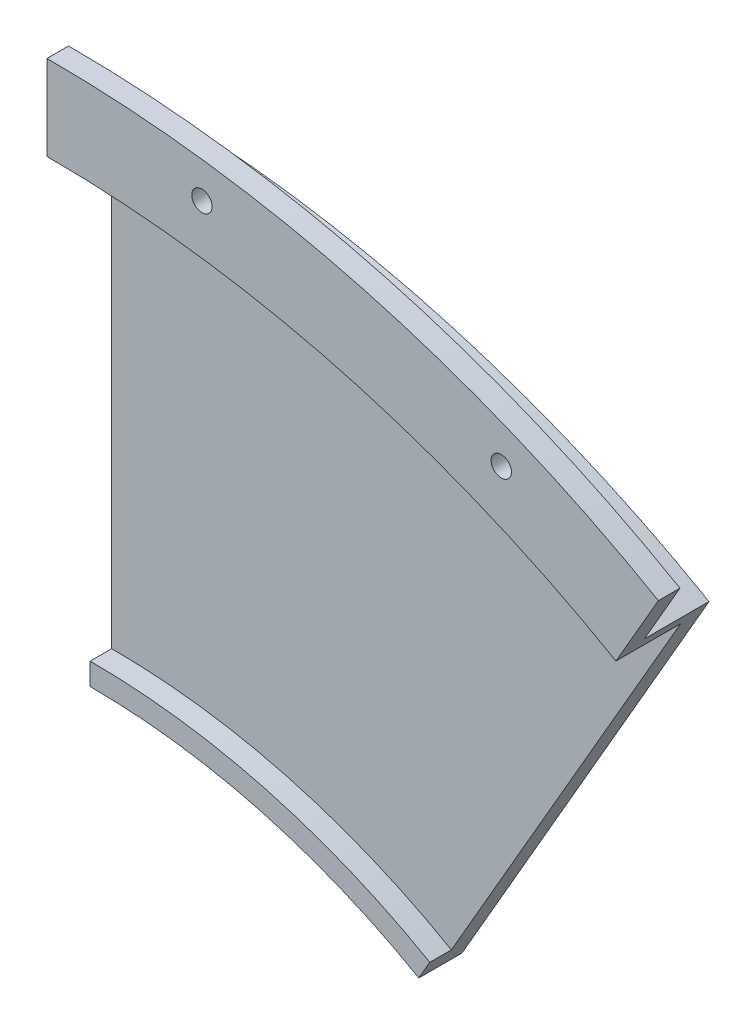
ISO-10303-21;
HEADER;
FILE_DESCRIPTION(('STEP AP214'),'2;1');
FILE_NAME('part.step','',(''),(''),'','','');
FILE_SCHEMA(('AUTOMOTIVE_DESIGN { 1 0 10303 214 1 1 1 1 }'));
ENDSEC;
DATA;
#1=APPLICATION_CONTEXT('core data for automotive mechanical design processes');
#2=APPLICATION_PROTOCOL_DEFINITION('international standard','automotive_design',2000,#1);
#3=PRODUCT_CONTEXT('',#1,'mechanical');
#4=PRODUCT('Part','Part','',(#3));
#5=PRODUCT_RELATED_PRODUCT_CATEGORY('part','',(#4));
#6=PRODUCT_DEFINITION_FORMATION('','',#4);
#7=PRODUCT_DEFINITION_CONTEXT('part definition',#1,'design');
#8=PRODUCT_DEFINITION('design','',#6,#7);
#9=PRODUCT_DEFINITION_SHAPE('','',#8);
#10=(LENGTH_UNIT() NAMED_UNIT(*) SI_UNIT(.MILLI.,.METRE.));
#11=(NAMED_UNIT(*) PLANE_ANGLE_UNIT() SI_UNIT($,.RADIAN.));
#12=(NAMED_UNIT(*) SI_UNIT($,.STERADIAN.) SOLID_ANGLE_UNIT());
#13=UNCERTAINTY_MEASURE_WITH_UNIT(LENGTH_MEASURE(1.E-05),#10,'distance_accuracy_value','');
#14=(GEOMETRIC_REPRESENTATION_CONTEXT(3) GLOBAL_UNCERTAINTY_ASSIGNED_CONTEXT((#13)) GLOBAL_UNIT_ASSIGNED_CONTEXT((#10,
#11,#12)) REPRESENTATION_CONTEXT('',''));
#15=CARTESIAN_POINT('',(0.,0.,0.));
#16=DIRECTION('',(0.,0.,1.));
#17=DIRECTION('',(1.,0.,0.));
#18=AXIS2_PLACEMENT_3D('',#15,#16,#17);
#19=CARTESIAN_POINT('',(0.,0.,12.7));
#20=DIRECTION('',(0.,0.,-1.));
#21=DIRECTION('',(-1.,0.,0.));
#22=AXIS2_PLACEMENT_3D('',#19,#20,#21);
#23=CYLINDRICAL_SURFACE('',#22,180.);
#24=CARTESIAN_POINT('',(0.,0.,9.525));
#25=DIRECTION('',(0.,0.,-1.));
#26=DIRECTION('',(-1.,0.,0.));
#27=AXIS2_PLACEMENT_3D('',#24,#25,#26);
#28=CIRCLE('',#27,180.);
#29=CARTESIAN_POINT('',(0.,180.,9.525));
#30=VERTEX_POINT('',#29);
#31=CARTESIAN_POINT('',(90.0000000000002,155.884572681199,9.525));
#32=VERTEX_POINT('',#31);
#33=EDGE_CURVE('E129',#30,#32,#28,.T.);
#34=ORIENTED_EDGE('',*,*,#33,.F.);
#35=DIRECTION('',(0.,0.,-1.));
#36=VECTOR('',#35,1.);
#37=CARTESIAN_POINT('',(0.,180.,12.7));
#38=LINE('',#37,#36);
#39=CARTESIAN_POINT('',(0.,180.,12.7));
#40=VERTEX_POINT('',#39);
#41=EDGE_CURVE('E128',#40,#30,#38,.T.);
#42=ORIENTED_EDGE('',*,*,#41,.F.);
#43=CARTESIAN_POINT('',(0.,0.,12.7));
#44=DIRECTION('',(0.,0.,1.));
#45=DIRECTION('',(1.,0.,0.));
#46=AXIS2_PLACEMENT_3D('',#43,#44,#45);
#47=CIRCLE('',#46,180.);
#48=CARTESIAN_POINT('',(90.0000000000002,155.884572681199,12.7));
#49=VERTEX_POINT('',#48);
#50=EDGE_CURVE('E173',#49,#40,#47,.T.);
#51=ORIENTED_EDGE('',*,*,#50,.F.);
#52=DIRECTION('',(0.,0.,-1.));
#53=VECTOR('',#52,1.);
#54=CARTESIAN_POINT('',(90.0000000000002,155.884572681199,12.7));
#55=LINE('',#54,#53);
#56=EDGE_CURVE('E41',#49,#32,#55,.T.);
#57=ORIENTED_EDGE('',*,*,#56,.T.);
#58=EDGE_LOOP('',(#34,#42,#51,#57));
#59=FACE_BOUND('',#58,.T.);
#60=ADVANCED_FACE('F33',(#59),#23,.T.);
#61=CARTESIAN_POINT('',(0.,0.,12.7));
#62=DIRECTION('',(0.,0.,-1.));
#63=DIRECTION('',(-1.,0.,0.));
#64=AXIS2_PLACEMENT_3D('',#61,#62,#63);
#65=CYLINDRICAL_SURFACE('',#64,96.7566582339079);
#66=CARTESIAN_POINT('',(0.,0.,6.35));
#67=DIRECTION('',(0.,0.,-1.));
#68=DIRECTION('',(1.,0.,0.));
#69=AXIS2_PLACEMENT_3D('',#66,#67,#68);
#70=CIRCLE('',#69,96.7566582339079);
#71=CARTESIAN_POINT('',(0.,96.7566582339079,6.35));
#72=VERTEX_POINT('',#71);
#73=CARTESIAN_POINT('',(48.378329116954,83.7937240158529,6.35));
#74=VERTEX_POINT('',#73);
#75=EDGE_CURVE('E137',#72,#74,#70,.T.);
#76=ORIENTED_EDGE('',*,*,#75,.F.);
#77=DIRECTION('',(0.,0.,-1.));
#78=VECTOR('',#77,1.);
#79=CARTESIAN_POINT('',(0.,96.7566582339079,12.7));
#80=LINE('',#79,#78);
#81=CARTESIAN_POINT('',(0.,96.7566582339079,0.));
#82=VERTEX_POINT('',#81);
#83=EDGE_CURVE('E179',#72,#82,#80,.T.);
#84=ORIENTED_EDGE('',*,*,#83,.T.);
#85=CARTESIAN_POINT('',(0.,0.,0.));
#86=DIRECTION('',(0.,0.,-1.));
#87=DIRECTION('',(-1.,0.,0.));
#88=AXIS2_PLACEMENT_3D('',#85,#86,#87);
#89=CIRCLE('',#88,96.7566582339079);
#90=CARTESIAN_POINT('',(48.378329116954,83.7937240158529,0.));
#91=VERTEX_POINT('',#90);
#92=EDGE_CURVE('E163',#82,#91,#89,.T.);
#93=ORIENTED_EDGE('',*,*,#92,.T.);
#94=DIRECTION('',(0.,0.,-1.));
#95=VECTOR('',#94,1.);
#96=CARTESIAN_POINT('',(48.378329116954,83.7937240158529,12.7));
#97=LINE('',#96,#95);
#98=EDGE_CURVE('E11',#74,#91,#97,.T.);
#99=ORIENTED_EDGE('',*,*,#98,.F.);
#100=EDGE_LOOP('',(#76,#84,#93,#99));
#101=FACE_BOUND('',#100,.T.);
#102=ADVANCED_FACE('F35',(#101),#65,.F.);
#103=CARTESIAN_POINT('',(48.378329116954,83.7937240158529,12.7));
#104=DIRECTION('',(-0.866025403784438,0.500000000000001,0.));
#105=DIRECTION('',(-0.500000000000001,-0.866025403784438,0.));
#106=AXIS2_PLACEMENT_3D('',#103,#104,#105);
#107=PLANE('',#106);
#108=DIRECTION('',(0.500000000000001,0.866025403784438,0.));
#109=VECTOR('',#108,1.);
#110=CARTESIAN_POINT('',(48.378329116954,83.7937240158529,0.));
#111=LINE('',#110,#109);
#112=CARTESIAN_POINT('',(84.7500000000002,146.791305941462,0.));
#113=VERTEX_POINT('',#112);
#114=EDGE_CURVE('E182',#91,#113,#111,.T.);
#115=ORIENTED_EDGE('',*,*,#114,.T.);
#116=DIRECTION('',(0.,0.,-1.));
#117=VECTOR('',#116,1.);
#118=CARTESIAN_POINT('',(84.7500000000002,146.791305941462,9.525));
#119=LINE('',#118,#117);
#120=CARTESIAN_POINT('',(84.7500000000002,146.791305941462,9.525));
#121=VERTEX_POINT('',#120);
#122=EDGE_CURVE('E48',#121,#113,#119,.T.);
#123=ORIENTED_EDGE('',*,*,#122,.F.);
#124=DIRECTION('',(-0.500000000000002,-0.866025403784437,0.));
#125=VECTOR('',#124,1.);
#126=CARTESIAN_POINT('',(84.7500000000002,146.791305941462,9.525));
#127=LINE('',#126,#125);
#128=EDGE_CURVE('E116',#32,#121,#127,.T.);
#129=ORIENTED_EDGE('',*,*,#128,.F.);
#130=ORIENTED_EDGE('',*,*,#56,.F.);
#131=DIRECTION('',(0.500000000000001,0.866025403784438,0.));
#132=VECTOR('',#131,1.);
#133=CARTESIAN_POINT('',(48.378329116954,83.7937240158529,12.7));
#134=LINE('',#133,#132);
#135=CARTESIAN_POINT('',(83.7500000000002,145.059255133893,12.7));
#136=VERTEX_POINT('',#135);
#137=EDGE_CURVE('E171',#136,#49,#134,.T.);
#138=ORIENTED_EDGE('',*,*,#137,.F.);
#139=DIRECTION('',(0.,0.,1.));
#140=VECTOR('',#139,1.);
#141=CARTESIAN_POINT('',(83.7500000000002,145.059255133893,3.175));
#142=LINE('',#141,#140);
#143=CARTESIAN_POINT('',(83.7500000000002,145.059255133893,3.175));
#144=VERTEX_POINT('',#143);
#145=EDGE_CURVE('E167',#144,#136,#142,.T.);
#146=ORIENTED_EDGE('',*,*,#145,.F.);
#147=DIRECTION('',(0.500000000000001,0.866025403784438,0.));
#148=VECTOR('',#147,1.);
#149=CARTESIAN_POINT('',(50.0000000000001,86.6025403784438,3.175));
#150=LINE('',#149,#148);
#151=CARTESIAN_POINT('',(50.0000000000001,86.6025403784438,3.175));
#152=VERTEX_POINT('',#151);
#153=EDGE_CURVE('E149',#152,#144,#150,.T.);
#154=ORIENTED_EDGE('',*,*,#153,.F.);
#155=DIRECTION('',(0.,0.,1.));
#156=VECTOR('',#155,1.);
#157=CARTESIAN_POINT('',(50.0000000000001,86.6025403784438,3.175));
#158=LINE('',#157,#156);
#159=CARTESIAN_POINT('',(50.0000000000001,86.6025403784438,6.35));
#160=VERTEX_POINT('',#159);
#161=EDGE_CURVE('E158',#152,#160,#158,.T.);
#162=ORIENTED_EDGE('',*,*,#161,.T.);
#163=DIRECTION('',(0.500000000000002,0.866025403784437,0.));
#164=VECTOR('',#163,1.);
#165=CARTESIAN_POINT('',(48.378329116954,83.7937240158529,6.35));
#166=LINE('',#165,#164);
#167=EDGE_CURVE('E56',#74,#160,#166,.T.);
#168=ORIENTED_EDGE('',*,*,#167,.F.);
#169=ORIENTED_EDGE('',*,*,#98,.T.);
#170=EDGE_LOOP('',(#115,#123,#129,#130,#138,#146,#154,#162,#168,#169));
#171=FACE_BOUND('',#170,.T.);
#172=ADVANCED_FACE('F194',(#171),#107,.F.);
#173=CARTESIAN_POINT('',(0.,96.7566582339079,12.7));
#174=DIRECTION('',(1.,0.,0.));
#175=DIRECTION('',(0.,0.,-1.));
#176=AXIS2_PLACEMENT_3D('',#173,#174,#175);
#177=PLANE('',#176);
#178=DIRECTION('',(0.,1.,0.));
#179=VECTOR('',#178,1.);
#180=CARTESIAN_POINT('',(0.,169.5,9.525));
#181=LINE('',#180,#179);
#182=CARTESIAN_POINT('',(0.,169.5,9.525));
#183=VERTEX_POINT('',#182);
#184=EDGE_CURVE('E120',#183,#30,#181,.T.);
#185=ORIENTED_EDGE('',*,*,#184,.F.);
#186=DIRECTION('',(0.,0.,-1.));
#187=VECTOR('',#186,1.);
#188=CARTESIAN_POINT('',(0.,169.5,9.525));
#189=LINE('',#188,#187);
#190=CARTESIAN_POINT('',(0.,169.5,0.));
#191=VERTEX_POINT('',#190);
#192=EDGE_CURVE('E107',#183,#191,#189,.T.);
#193=ORIENTED_EDGE('',*,*,#192,.T.);
#194=DIRECTION('',(0.,-1.,0.));
#195=VECTOR('',#194,1.);
#196=CARTESIAN_POINT('',(0.,96.7566582339079,0.));
#197=LINE('',#196,#195);
#198=EDGE_CURVE('E174',#191,#82,#197,.T.);
#199=ORIENTED_EDGE('',*,*,#198,.T.);
#200=ORIENTED_EDGE('',*,*,#83,.F.);
#201=DIRECTION('',(0.,-1.,0.));
#202=VECTOR('',#201,1.);
#203=CARTESIAN_POINT('',(0.,96.7566582339079,6.35));
#204=LINE('',#203,#202);
#205=CARTESIAN_POINT('',(0.,100.,6.35));
#206=VERTEX_POINT('',#205);
#207=EDGE_CURVE('E143',#206,#72,#204,.T.);
#208=ORIENTED_EDGE('',*,*,#207,.F.);
#209=DIRECTION('',(0.,0.,1.));
#210=VECTOR('',#209,1.);
#211=CARTESIAN_POINT('',(0.,100.,3.175));
#212=LINE('',#211,#210);
#213=CARTESIAN_POINT('',(0.,100.,3.175));
#214=VERTEX_POINT('',#213);
#215=EDGE_CURVE('E160',#214,#206,#212,.T.);
#216=ORIENTED_EDGE('',*,*,#215,.F.);
#217=DIRECTION('',(0.,-1.,0.));
#218=VECTOR('',#217,1.);
#219=CARTESIAN_POINT('',(0.,100.,3.175));
#220=LINE('',#219,#218);
#221=CARTESIAN_POINT('',(0.,167.5,3.175));
#222=VERTEX_POINT('',#221);
#223=EDGE_CURVE('E155',#222,#214,#220,.T.);
#224=ORIENTED_EDGE('',*,*,#223,.F.);
#225=DIRECTION('',(0.,0.,1.));
#226=VECTOR('',#225,1.);
#227=CARTESIAN_POINT('',(0.,167.5,3.175));
#228=LINE('',#227,#226);
#229=CARTESIAN_POINT('',(0.,167.5,12.7));
#230=VERTEX_POINT('',#229);
#231=EDGE_CURVE('E164',#222,#230,#228,.T.);
#232=ORIENTED_EDGE('',*,*,#231,.T.);
#233=DIRECTION('',(0.,-1.,0.));
#234=VECTOR('',#233,1.);
#235=CARTESIAN_POINT('',(0.,96.7566582339079,12.7));
#236=LINE('',#235,#234);
#237=EDGE_CURVE('E176',#40,#230,#236,.T.);
#238=ORIENTED_EDGE('',*,*,#237,.F.);
#239=ORIENTED_EDGE('',*,*,#41,.T.);
#240=EDGE_LOOP('',(#185,#193,#199,#200,#208,#216,#224,#232,#238,#239));
#241=FACE_BOUND('',#240,.T.);
#242=ADVANCED_FACE('F125',(#241),#177,.F.);
#243=CARTESIAN_POINT('',(0.,0.,3.175));
#244=DIRECTION('',(0.,0.,1.));
#245=DIRECTION('',(1.,0.,0.));
#246=AXIS2_PLACEMENT_3D('',#243,#244,#245);
#247=CYLINDRICAL_SURFACE('',#246,100.);
#248=CARTESIAN_POINT('',(0.,0.,6.35));
#249=DIRECTION('',(0.,0.,1.));
#250=DIRECTION('',(1.,0.,0.));
#251=AXIS2_PLACEMENT_3D('',#248,#249,#250);
#252=CIRCLE('',#251,100.);
#253=EDGE_CURVE('E141',#160,#206,#252,.T.);
#254=ORIENTED_EDGE('',*,*,#253,.F.);
#255=ORIENTED_EDGE('',*,*,#161,.F.);
#256=CARTESIAN_POINT('',(0.,0.,3.175));
#257=DIRECTION('',(0.,0.,-1.));
#258=DIRECTION('',(1.,0.,0.));
#259=AXIS2_PLACEMENT_3D('',#256,#257,#258);
#260=CIRCLE('',#259,100.);
#261=EDGE_CURVE('E146',#214,#152,#260,.T.);
#262=ORIENTED_EDGE('',*,*,#261,.F.);
#263=ORIENTED_EDGE('',*,*,#215,.T.);
#264=EDGE_LOOP('',(#254,#255,#262,#263));
#265=FACE_BOUND('',#264,.T.);
#266=ADVANCED_FACE('F208',(#265),#247,.T.);
#267=CARTESIAN_POINT('',(0.,0.,12.7));
#268=DIRECTION('',(0.,0.,-1.));
#269=DIRECTION('',(-1.,0.,0.));
#270=AXIS2_PLACEMENT_3D('',#267,#268,#269);
#271=PLANE('',#270);
#272=CARTESIAN_POINT('',(66.8739298057996,161.447948306347,12.7));
#273=DIRECTION('',(0.,0.,-1.));
#274=DIRECTION('',(1.,0.,0.));
#275=AXIS2_PLACEMENT_3D('',#272,#273,#274);
#276=CIRCLE('',#275,1.49999999999999);
#277=CARTESIAN_POINT('',(68.3739298057996,161.447948306347,12.7));
#278=VERTEX_POINT('',#277);
#279=EDGE_CURVE('E250',#278,#278,#276,.T.);
#280=ORIENTED_EDGE('',*,*,#279,.T.);
#281=EDGE_LOOP('',(#280));
#282=FACE_BOUND('',#281,.T.);
#283=CARTESIAN_POINT('',(22.8094520904541,173.254989525073,12.7));
#284=DIRECTION('',(0.,0.,-1.));
#285=DIRECTION('',(-1.,0.,0.));
#286=AXIS2_PLACEMENT_3D('',#283,#284,#285);
#287=CIRCLE('',#286,1.5);
#288=CARTESIAN_POINT('',(21.3094520904541,173.254989525073,12.7));
#289=VERTEX_POINT('',#288);
#290=EDGE_CURVE('E136',#289,#289,#287,.T.);
#291=ORIENTED_EDGE('',*,*,#290,.T.);
#292=EDGE_LOOP('',(#291));
#293=FACE_BOUND('',#292,.T.);
#294=ORIENTED_EDGE('',*,*,#237,.T.);
#295=CARTESIAN_POINT('',(0.,0.,12.7));
#296=DIRECTION('',(0.,0.,1.));
#297=DIRECTION('',(1.,0.,0.));
#298=AXIS2_PLACEMENT_3D('',#295,#296,#297);
#299=CIRCLE('',#298,167.5);
#300=EDGE_CURVE('E145',#136,#230,#299,.T.);
#301=ORIENTED_EDGE('',*,*,#300,.F.);
#302=ORIENTED_EDGE('',*,*,#137,.T.);
#303=ORIENTED_EDGE('',*,*,#50,.T.);
#304=EDGE_LOOP('',(#294,#301,#302,#303));
#305=FACE_BOUND('',#304,.T.);
#306=ADVANCED_FACE('F215',(#282,#293,#305),#271,.F.);
#307=CARTESIAN_POINT('',(0.,0.,0.));
#308=DIRECTION('',(0.,0.,-1.));
#309=DIRECTION('',(-1.,0.,0.));
#310=AXIS2_PLACEMENT_3D('',#307,#308,#309);
#311=PLANE('',#310);
#312=CARTESIAN_POINT('',(0.,0.,0.));
#313=DIRECTION('',(0.,0.,1.));
#314=DIRECTION('',(-1.,0.,0.));
#315=AXIS2_PLACEMENT_3D('',#312,#313,#314);
#316=CIRCLE('',#315,169.5);
#317=EDGE_CURVE('E112',#113,#191,#316,.T.);
#318=ORIENTED_EDGE('',*,*,#317,.F.);
#319=ORIENTED_EDGE('',*,*,#114,.F.);
#320=ORIENTED_EDGE('',*,*,#92,.F.);
#321=ORIENTED_EDGE('',*,*,#198,.F.);
#322=EDGE_LOOP('',(#318,#319,#320,#321));
#323=FACE_BOUND('',#322,.T.);
#324=ADVANCED_FACE('F200',(#323),#311,.T.);
#325=CARTESIAN_POINT('',(0.,0.,3.175));
#326=DIRECTION('',(0.,0.,1.));
#327=DIRECTION('',(1.,0.,0.));
#328=AXIS2_PLACEMENT_3D('',#325,#326,#327);
#329=CYLINDRICAL_SURFACE('',#328,167.5);
#330=ORIENTED_EDGE('',*,*,#300,.T.);
#331=ORIENTED_EDGE('',*,*,#231,.F.);
#332=CARTESIAN_POINT('',(0.,0.,3.175));
#333=DIRECTION('',(0.,0.,1.));
#334=DIRECTION('',(1.,0.,0.));
#335=AXIS2_PLACEMENT_3D('',#332,#333,#334);
#336=CIRCLE('',#335,167.5);
#337=EDGE_CURVE('E152',#144,#222,#336,.T.);
#338=ORIENTED_EDGE('',*,*,#337,.F.);
#339=ORIENTED_EDGE('',*,*,#145,.T.);
#340=EDGE_LOOP('',(#330,#331,#338,#339));
#341=FACE_BOUND('',#340,.T.);
#342=ADVANCED_FACE('F216',(#341),#329,.F.);
#343=CARTESIAN_POINT('',(0.,0.,3.175));
#344=DIRECTION('',(0.,0.,1.));
#345=DIRECTION('',(1.,0.,0.));
#346=AXIS2_PLACEMENT_3D('',#343,#344,#345);
#347=PLANE('',#346);
#348=ORIENTED_EDGE('',*,*,#261,.T.);
#349=ORIENTED_EDGE('',*,*,#153,.T.);
#350=ORIENTED_EDGE('',*,*,#337,.T.);
#351=ORIENTED_EDGE('',*,*,#223,.T.);
#352=EDGE_LOOP('',(#348,#349,#350,#351));
#353=FACE_BOUND('',#352,.T.);
#354=ADVANCED_FACE('F211',(#353),#347,.T.);
#355=CARTESIAN_POINT('',(0.,0.,6.35));
#356=DIRECTION('',(0.,0.,1.));
#357=DIRECTION('',(1.,0.,0.));
#358=AXIS2_PLACEMENT_3D('',#355,#356,#357);
#359=PLANE('',#358);
#360=ORIENTED_EDGE('',*,*,#75,.T.);
#361=ORIENTED_EDGE('',*,*,#167,.T.);
#362=ORIENTED_EDGE('',*,*,#253,.T.);
#363=ORIENTED_EDGE('',*,*,#207,.T.);
#364=EDGE_LOOP('',(#360,#361,#362,#363));
#365=FACE_BOUND('',#364,.T.);
#366=ADVANCED_FACE('F223',(#365),#359,.T.);
#367=CARTESIAN_POINT('',(0.,0.,9.525));
#368=DIRECTION('',(0.,0.,-1.));
#369=DIRECTION('',(-1.,0.,0.));
#370=AXIS2_PLACEMENT_3D('',#367,#368,#369);
#371=CYLINDRICAL_SURFACE('',#370,169.5);
#372=ORIENTED_EDGE('',*,*,#317,.T.);
#373=ORIENTED_EDGE('',*,*,#192,.F.);
#374=CARTESIAN_POINT('',(0.,0.,9.525));
#375=DIRECTION('',(0.,0.,1.));
#376=DIRECTION('',(-1.,0.,0.));
#377=AXIS2_PLACEMENT_3D('',#374,#375,#376);
#378=CIRCLE('',#377,169.5);
#379=EDGE_CURVE('E110',#121,#183,#378,.T.);
#380=ORIENTED_EDGE('',*,*,#379,.F.);
#381=ORIENTED_EDGE('',*,*,#122,.T.);
#382=EDGE_LOOP('',(#372,#373,#380,#381));
#383=FACE_BOUND('',#382,.T.);
#384=ADVANCED_FACE('F109',(#383),#371,.T.);
#385=CARTESIAN_POINT('',(0.,0.,9.525));
#386=DIRECTION('',(0.,0.,-1.));
#387=DIRECTION('',(-1.,0.,0.));
#388=AXIS2_PLACEMENT_3D('',#385,#386,#387);
#389=PLANE('',#388);
#390=CARTESIAN_POINT('',(66.8739298057996,161.447948306347,9.525));
#391=DIRECTION('',(0.,0.,-1.));
#392=DIRECTION('',(1.,0.,0.));
#393=AXIS2_PLACEMENT_3D('',#390,#391,#392);
#394=CIRCLE('',#393,1.49999999999999);
#395=CARTESIAN_POINT('',(68.3739298057996,161.447948306347,9.525));
#396=VERTEX_POINT('',#395);
#397=EDGE_CURVE('E258',#396,#396,#394,.T.);
#398=ORIENTED_EDGE('',*,*,#397,.F.);
#399=EDGE_LOOP('',(#398));
#400=FACE_BOUND('',#399,.T.);
#401=CARTESIAN_POINT('',(22.8094520904541,173.254989525073,9.525));
#402=DIRECTION('',(0.,0.,-1.));
#403=DIRECTION('',(-1.,0.,0.));
#404=AXIS2_PLACEMENT_3D('',#401,#402,#403);
#405=CIRCLE('',#404,1.5);
#406=CARTESIAN_POINT('',(21.3094520904541,173.254989525073,9.525));
#407=VERTEX_POINT('',#406);
#408=EDGE_CURVE('E254',#407,#407,#405,.T.);
#409=ORIENTED_EDGE('',*,*,#408,.F.);
#410=EDGE_LOOP('',(#409));
#411=FACE_BOUND('',#410,.T.);
#412=ORIENTED_EDGE('',*,*,#379,.T.);
#413=ORIENTED_EDGE('',*,*,#184,.T.);
#414=ORIENTED_EDGE('',*,*,#33,.T.);
#415=ORIENTED_EDGE('',*,*,#128,.T.);
#416=EDGE_LOOP('',(#412,#413,#414,#415));
#417=FACE_BOUND('',#416,.T.);
#418=ADVANCED_FACE('F119',(#400,#411,#417),#389,.T.);
#419=CARTESIAN_POINT('',(22.8094520904541,173.254989525073,12.7));
#420=DIRECTION('',(0.,0.,-1.));
#421=DIRECTION('',(-1.,0.,0.));
#422=AXIS2_PLACEMENT_3D('',#419,#420,#421);
#423=CYLINDRICAL_SURFACE('',#422,1.5);
#424=ORIENTED_EDGE('',*,*,#290,.F.);
#425=EDGE_LOOP('',(#424));
#426=FACE_BOUND('',#425,.T.);
#427=ORIENTED_EDGE('',*,*,#408,.T.);
#428=EDGE_LOOP('',(#427));
#429=FACE_BOUND('',#428,.T.);
#430=ADVANCED_FACE('F267',(#426,#429),#423,.F.);
#431=CARTESIAN_POINT('',(66.8739298057996,161.447948306347,12.7));
#432=DIRECTION('',(0.,0.,-1.));
#433=DIRECTION('',(-1.,0.,0.));
#434=AXIS2_PLACEMENT_3D('',#431,#432,#433);
#435=CYLINDRICAL_SURFACE('',#434,1.49999999999999);
#436=ORIENTED_EDGE('',*,*,#279,.F.);
#437=EDGE_LOOP('',(#436));
#438=FACE_BOUND('',#437,.T.);
#439=ORIENTED_EDGE('',*,*,#397,.T.);
#440=EDGE_LOOP('',(#439));
#441=FACE_BOUND('',#440,.T.);
#442=ADVANCED_FACE('F263',(#438,#441),#435,.F.);
#443=CLOSED_SHELL('',(#60,#102,#172,#242,#266,#306,#324,#342,#354,#366,#384,#418,#430,#442));
#444=MANIFOLD_SOLID_BREP('B2',#443);
#445=ADVANCED_BREP_SHAPE_REPRESENTATION('',(#18,#444),#14);
#446=SHAPE_DEFINITION_REPRESENTATION(#9,#445);
ENDSEC;
END-ISO-10303-21;
